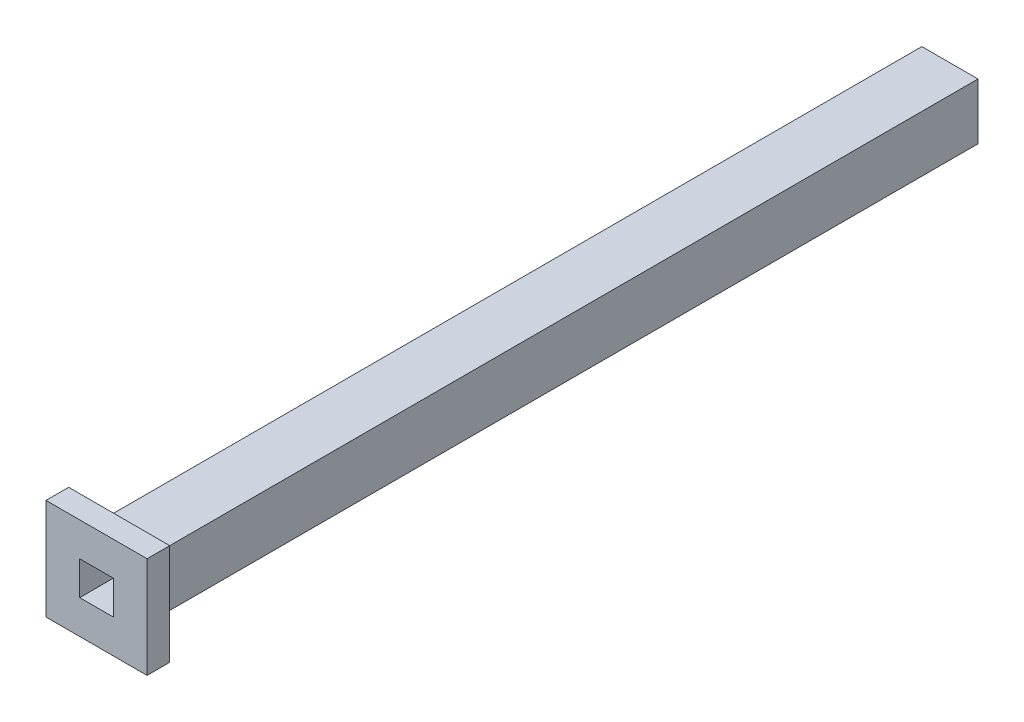
ISO-10303-21;
HEADER;
FILE_DESCRIPTION(('STEP AP214'),'2;1');
FILE_NAME('part.step','',(''),(''),'','','');
FILE_SCHEMA(('AUTOMOTIVE_DESIGN { 1 0 10303 214 1 1 1 1 }'));
ENDSEC;
DATA;
#1=APPLICATION_CONTEXT('core data for automotive mechanical design processes');
#2=APPLICATION_PROTOCOL_DEFINITION('international standard','automotive_design',2000,#1);
#3=PRODUCT_CONTEXT('',#1,'mechanical');
#4=PRODUCT('Part','Part','',(#3));
#5=PRODUCT_RELATED_PRODUCT_CATEGORY('part','',(#4));
#6=PRODUCT_DEFINITION_FORMATION('','',#4);
#7=PRODUCT_DEFINITION_CONTEXT('part definition',#1,'design');
#8=PRODUCT_DEFINITION('design','',#6,#7);
#9=PRODUCT_DEFINITION_SHAPE('','',#8);
#10=(LENGTH_UNIT() NAMED_UNIT(*) SI_UNIT(.MILLI.,.METRE.));
#11=(NAMED_UNIT(*) PLANE_ANGLE_UNIT() SI_UNIT($,.RADIAN.));
#12=(NAMED_UNIT(*) SI_UNIT($,.STERADIAN.) SOLID_ANGLE_UNIT());
#13=UNCERTAINTY_MEASURE_WITH_UNIT(LENGTH_MEASURE(1.E-05),#10,'distance_accuracy_value','');
#14=(GEOMETRIC_REPRESENTATION_CONTEXT(3) GLOBAL_UNCERTAINTY_ASSIGNED_CONTEXT((#13)) GLOBAL_UNIT_ASSIGNED_CONTEXT((#10,
#11,#12)) REPRESENTATION_CONTEXT('',''));
#15=CARTESIAN_POINT('',(0.,0.,0.));
#16=DIRECTION('',(0.,0.,1.));
#17=DIRECTION('',(1.,0.,0.));
#18=AXIS2_PLACEMENT_3D('',#15,#16,#17);
#19=CARTESIAN_POINT('',(0.,0.,0.5));
#20=DIRECTION('',(0.,0.,1.));
#21=DIRECTION('',(1.,0.,0.));
#22=AXIS2_PLACEMENT_3D('',#19,#20,#21);
#23=PLANE('',#22);
#24=DIRECTION('',(0.,-1.,0.));
#25=VECTOR('',#24,1.);
#26=CARTESIAN_POINT('',(11.,0.,0.5));
#27=LINE('',#26,#25);
#28=CARTESIAN_POINT('',(11.,9.,0.5));
#29=VERTEX_POINT('',#28);
#30=CARTESIAN_POINT('',(11.,-5.,0.5));
#31=VERTEX_POINT('',#30);
#32=EDGE_CURVE('E11',#29,#31,#27,.T.);
#33=ORIENTED_EDGE('',*,*,#32,.F.);
#34=DIRECTION('',(1.,0.,0.));
#35=VECTOR('',#34,1.);
#36=CARTESIAN_POINT('',(0.,9.,0.5));
#37=LINE('',#36,#35);
#38=CARTESIAN_POINT('',(-3.,9.,0.5));
#39=VERTEX_POINT('',#38);
#40=EDGE_CURVE('E273',#39,#29,#37,.T.);
#41=ORIENTED_EDGE('',*,*,#40,.F.);
#42=DIRECTION('',(0.,1.,0.));
#43=VECTOR('',#42,1.);
#44=CARTESIAN_POINT('',(-3.,0.,0.5));
#45=LINE('',#44,#43);
#46=CARTESIAN_POINT('',(-3.,-5.,0.5));
#47=VERTEX_POINT('',#46);
#48=EDGE_CURVE('E275',#47,#39,#45,.T.);
#49=ORIENTED_EDGE('',*,*,#48,.F.);
#50=DIRECTION('',(-1.,0.,0.));
#51=VECTOR('',#50,1.);
#52=CARTESIAN_POINT('',(0.,-5.,0.5));
#53=LINE('',#52,#51);
#54=EDGE_CURVE('E45',#31,#47,#53,.T.);
#55=ORIENTED_EDGE('',*,*,#54,.F.);
#56=EDGE_LOOP('',(#33,#41,#49,#55));
#57=FACE_BOUND('',#56,.T.);
#58=DIRECTION('',(0.,-1.,0.));
#59=VECTOR('',#58,1.);
#60=CARTESIAN_POINT('',(13.,11.,0.5));
#61=LINE('',#60,#59);
#62=CARTESIAN_POINT('',(13.,11.,0.5));
#63=VERTEX_POINT('',#62);
#64=CARTESIAN_POINT('',(13.,-7.,0.5));
#65=VERTEX_POINT('',#64);
#66=EDGE_CURVE('E226',#63,#65,#61,.T.);
#67=ORIENTED_EDGE('',*,*,#66,.T.);
#68=DIRECTION('',(-1.,0.,0.));
#69=VECTOR('',#68,1.);
#70=CARTESIAN_POINT('',(13.,-7.,0.5));
#71=LINE('',#70,#69);
#72=CARTESIAN_POINT('',(-5.,-7.,0.5));
#73=VERTEX_POINT('',#72);
#74=EDGE_CURVE('E229',#65,#73,#71,.T.);
#75=ORIENTED_EDGE('',*,*,#74,.T.);
#76=DIRECTION('',(0.,1.,0.));
#77=VECTOR('',#76,1.);
#78=CARTESIAN_POINT('',(-5.,11.,0.5));
#79=LINE('',#78,#77);
#80=CARTESIAN_POINT('',(-5.,11.,0.5));
#81=VERTEX_POINT('',#80);
#82=EDGE_CURVE('E232',#73,#81,#79,.T.);
#83=ORIENTED_EDGE('',*,*,#82,.T.);
#84=DIRECTION('',(1.,0.,0.));
#85=VECTOR('',#84,1.);
#86=CARTESIAN_POINT('',(13.,11.,0.5));
#87=LINE('',#86,#85);
#88=EDGE_CURVE('E235',#81,#63,#87,.T.);
#89=ORIENTED_EDGE('',*,*,#88,.T.);
#90=EDGE_LOOP('',(#67,#75,#83,#89));
#91=FACE_BOUND('',#90,.T.);
#92=ADVANCED_FACE('F38',(#57,#91),#23,.F.);
#93=CARTESIAN_POINT('',(0.,0.,4.54));
#94=DIRECTION('',(0.,0.,1.));
#95=DIRECTION('',(1.,0.,0.));
#96=AXIS2_PLACEMENT_3D('',#93,#94,#95);
#97=PLANE('',#96);
#98=DIRECTION('',(0.,-1.,0.));
#99=VECTOR('',#98,1.);
#100=CARTESIAN_POINT('',(-5.,11.,4.54));
#101=LINE('',#100,#99);
#102=CARTESIAN_POINT('',(-5.,11.,4.54));
#103=VERTEX_POINT('',#102);
#104=CARTESIAN_POINT('',(-5.,-7.,4.54));
#105=VERTEX_POINT('',#104);
#106=EDGE_CURVE('E212',#103,#105,#101,.T.);
#107=ORIENTED_EDGE('',*,*,#106,.T.);
#108=DIRECTION('',(1.,0.,0.));
#109=VECTOR('',#108,1.);
#110=CARTESIAN_POINT('',(-5.,-7.,4.54));
#111=LINE('',#110,#109);
#112=CARTESIAN_POINT('',(13.,-7.,4.54));
#113=VERTEX_POINT('',#112);
#114=EDGE_CURVE('E217',#105,#113,#111,.T.);
#115=ORIENTED_EDGE('',*,*,#114,.T.);
#116=DIRECTION('',(0.,1.,0.));
#117=VECTOR('',#116,1.);
#118=CARTESIAN_POINT('',(13.,11.,4.54));
#119=LINE('',#118,#117);
#120=CARTESIAN_POINT('',(13.,11.,4.54));
#121=VERTEX_POINT('',#120);
#122=EDGE_CURVE('E220',#113,#121,#119,.T.);
#123=ORIENTED_EDGE('',*,*,#122,.T.);
#124=DIRECTION('',(-1.,0.,0.));
#125=VECTOR('',#124,1.);
#126=CARTESIAN_POINT('',(-5.,11.,4.54));
#127=LINE('',#126,#125);
#128=EDGE_CURVE('E223',#121,#103,#127,.T.);
#129=ORIENTED_EDGE('',*,*,#128,.T.);
#130=EDGE_LOOP('',(#107,#115,#123,#129));
#131=FACE_BOUND('',#130,.T.);
#132=DIRECTION('',(0.,-1.,0.));
#133=VECTOR('',#132,1.);
#134=CARTESIAN_POINT('',(1.,5.,4.54));
#135=LINE('',#134,#133);
#136=CARTESIAN_POINT('',(1.,5.,4.54));
#137=VERTEX_POINT('',#136);
#138=CARTESIAN_POINT('',(1.,-1.,4.54));
#139=VERTEX_POINT('',#138);
#140=EDGE_CURVE('E177',#137,#139,#135,.T.);
#141=ORIENTED_EDGE('',*,*,#140,.F.);
#142=DIRECTION('',(-1.,0.,0.));
#143=VECTOR('',#142,1.);
#144=CARTESIAN_POINT('',(1.,5.,4.54));
#145=LINE('',#144,#143);
#146=CARTESIAN_POINT('',(7.,5.,4.54));
#147=VERTEX_POINT('',#146);
#148=EDGE_CURVE('E182',#147,#137,#145,.T.);
#149=ORIENTED_EDGE('',*,*,#148,.F.);
#150=DIRECTION('',(0.,1.,0.));
#151=VECTOR('',#150,1.);
#152=CARTESIAN_POINT('',(7.,5.,4.54));
#153=LINE('',#152,#151);
#154=CARTESIAN_POINT('',(7.,-1.,4.54));
#155=VERTEX_POINT('',#154);
#156=EDGE_CURVE('E196',#155,#147,#153,.T.);
#157=ORIENTED_EDGE('',*,*,#156,.F.);
#158=DIRECTION('',(1.,0.,0.));
#159=VECTOR('',#158,1.);
#160=CARTESIAN_POINT('',(1.,-1.,4.54));
#161=LINE('',#160,#159);
#162=EDGE_CURVE('E193',#139,#155,#161,.T.);
#163=ORIENTED_EDGE('',*,*,#162,.F.);
#164=EDGE_LOOP('',(#141,#149,#157,#163));
#165=FACE_BOUND('',#164,.T.);
#166=ADVANCED_FACE('F298',(#131,#165),#97,.T.);
#167=CARTESIAN_POINT('',(0.,0.,2.54));
#168=DIRECTION('',(0.,0.,1.));
#169=DIRECTION('',(1.,0.,0.));
#170=AXIS2_PLACEMENT_3D('',#167,#168,#169);
#171=PLANE('',#170);
#172=DIRECTION('',(-1.,0.,0.));
#173=VECTOR('',#172,1.);
#174=CARTESIAN_POINT('',(9.,-3.,2.54));
#175=LINE('',#174,#173);
#176=CARTESIAN_POINT('',(9.,-3.,2.54));
#177=VERTEX_POINT('',#176);
#178=CARTESIAN_POINT('',(-0.999999999999999,-3.,2.53999999999999));
#179=VERTEX_POINT('',#178);
#180=EDGE_CURVE('E60',#177,#179,#175,.T.);
#181=ORIENTED_EDGE('',*,*,#180,.F.);
#182=DIRECTION('',(0.,-1.,0.));
#183=VECTOR('',#182,1.);
#184=CARTESIAN_POINT('',(9.,7.,2.54));
#185=LINE('',#184,#183);
#186=CARTESIAN_POINT('',(9.,7.,2.54));
#187=VERTEX_POINT('',#186);
#188=EDGE_CURVE('E155',#187,#177,#185,.T.);
#189=ORIENTED_EDGE('',*,*,#188,.F.);
#190=DIRECTION('',(1.,0.,0.));
#191=VECTOR('',#190,1.);
#192=CARTESIAN_POINT('',(9.,7.,2.54));
#193=LINE('',#192,#191);
#194=CARTESIAN_POINT('',(-0.999999999999999,7.,2.54));
#195=VERTEX_POINT('',#194);
#196=EDGE_CURVE('E270',#195,#187,#193,.T.);
#197=ORIENTED_EDGE('',*,*,#196,.F.);
#198=DIRECTION('',(0.,1.,0.));
#199=VECTOR('',#198,1.);
#200=CARTESIAN_POINT('',(-0.999999999999999,7.,2.54));
#201=LINE('',#200,#199);
#202=EDGE_CURVE('E267',#179,#195,#201,.T.);
#203=ORIENTED_EDGE('',*,*,#202,.F.);
#204=EDGE_LOOP('',(#181,#189,#197,#203));
#205=FACE_BOUND('',#204,.T.);
#206=DIRECTION('',(0.,-1.,0.));
#207=VECTOR('',#206,1.);
#208=CARTESIAN_POINT('',(11.,9.,2.54));
#209=LINE('',#208,#207);
#210=CARTESIAN_POINT('',(11.,9.,2.54));
#211=VERTEX_POINT('',#210);
#212=CARTESIAN_POINT('',(11.,-5.,2.54));
#213=VERTEX_POINT('',#212);
#214=EDGE_CURVE('E241',#211,#213,#209,.T.);
#215=ORIENTED_EDGE('',*,*,#214,.T.);
#216=DIRECTION('',(-1.,0.,0.));
#217=VECTOR('',#216,1.);
#218=CARTESIAN_POINT('',(11.,-5.,2.54));
#219=LINE('',#218,#217);
#220=CARTESIAN_POINT('',(-3.,-5.,2.54));
#221=VERTEX_POINT('',#220);
#222=EDGE_CURVE('E249',#213,#221,#219,.T.);
#223=ORIENTED_EDGE('',*,*,#222,.T.);
#224=DIRECTION('',(0.,1.,0.));
#225=VECTOR('',#224,1.);
#226=CARTESIAN_POINT('',(-3.,9.,2.54));
#227=LINE('',#226,#225);
#228=CARTESIAN_POINT('',(-3.,9.,2.54));
#229=VERTEX_POINT('',#228);
#230=EDGE_CURVE('E252',#221,#229,#227,.T.);
#231=ORIENTED_EDGE('',*,*,#230,.T.);
#232=DIRECTION('',(1.,0.,0.));
#233=VECTOR('',#232,1.);
#234=CARTESIAN_POINT('',(11.,9.,2.54));
#235=LINE('',#234,#233);
#236=EDGE_CURVE('E255',#229,#211,#235,.T.);
#237=ORIENTED_EDGE('',*,*,#236,.T.);
#238=EDGE_LOOP('',(#215,#223,#231,#237));
#239=FACE_BOUND('',#238,.T.);
#240=ADVANCED_FACE('F296',(#205,#239),#171,.F.);
#241=CARTESIAN_POINT('',(11.,9.,-7.46));
#242=DIRECTION('',(-1.,0.,0.));
#243=DIRECTION('',(0.,-1.,0.));
#244=AXIS2_PLACEMENT_3D('',#241,#242,#243);
#245=PLANE('',#244);
#246=ORIENTED_EDGE('',*,*,#32,.T.);
#247=DIRECTION('',(0.,0.,1.));
#248=VECTOR('',#247,1.);
#249=CARTESIAN_POINT('',(11.,-5.,-7.46));
#250=LINE('',#249,#248);
#251=EDGE_CURVE('E263',#31,#213,#250,.T.);
#252=ORIENTED_EDGE('',*,*,#251,.T.);
#253=ORIENTED_EDGE('',*,*,#214,.F.);
#254=DIRECTION('',(0.,0.,1.));
#255=VECTOR('',#254,1.);
#256=CARTESIAN_POINT('',(11.,9.,-7.46));
#257=LINE('',#256,#255);
#258=EDGE_CURVE('E258',#29,#211,#257,.T.);
#259=ORIENTED_EDGE('',*,*,#258,.F.);
#260=EDGE_LOOP('',(#246,#252,#253,#259));
#261=FACE_BOUND('',#260,.T.);
#262=ADVANCED_FACE('F294',(#261),#245,.T.);
#263=CARTESIAN_POINT('',(11.,-5.,-7.46));
#264=DIRECTION('',(0.,1.,0.));
#265=DIRECTION('',(0.,0.,1.));
#266=AXIS2_PLACEMENT_3D('',#263,#264,#265);
#267=PLANE('',#266);
#268=ORIENTED_EDGE('',*,*,#54,.T.);
#269=DIRECTION('',(0.,0.,1.));
#270=VECTOR('',#269,1.);
#271=CARTESIAN_POINT('',(-3.,-5.,-7.46));
#272=LINE('',#271,#270);
#273=EDGE_CURVE('E261',#47,#221,#272,.T.);
#274=ORIENTED_EDGE('',*,*,#273,.T.);
#275=ORIENTED_EDGE('',*,*,#222,.F.);
#276=ORIENTED_EDGE('',*,*,#251,.F.);
#277=EDGE_LOOP('',(#268,#274,#275,#276));
#278=FACE_BOUND('',#277,.T.);
#279=ADVANCED_FACE('F280',(#278),#267,.T.);
#280=CARTESIAN_POINT('',(-3.,9.,-7.46));
#281=DIRECTION('',(1.,0.,0.));
#282=DIRECTION('',(0.,1.,0.));
#283=AXIS2_PLACEMENT_3D('',#280,#281,#282);
#284=PLANE('',#283);
#285=ORIENTED_EDGE('',*,*,#48,.T.);
#286=DIRECTION('',(0.,0.,1.));
#287=VECTOR('',#286,1.);
#288=CARTESIAN_POINT('',(-3.,9.,-7.46));
#289=LINE('',#288,#287);
#290=EDGE_CURVE('E52',#39,#229,#289,.T.);
#291=ORIENTED_EDGE('',*,*,#290,.T.);
#292=ORIENTED_EDGE('',*,*,#230,.F.);
#293=ORIENTED_EDGE('',*,*,#273,.F.);
#294=EDGE_LOOP('',(#285,#291,#292,#293));
#295=FACE_BOUND('',#294,.T.);
#296=ADVANCED_FACE('F287',(#295),#284,.T.);
#297=CARTESIAN_POINT('',(11.,9.,-7.46));
#298=DIRECTION('',(0.,-1.,0.));
#299=DIRECTION('',(0.,0.,-1.));
#300=AXIS2_PLACEMENT_3D('',#297,#298,#299);
#301=PLANE('',#300);
#302=ORIENTED_EDGE('',*,*,#40,.T.);
#303=ORIENTED_EDGE('',*,*,#258,.T.);
#304=ORIENTED_EDGE('',*,*,#236,.F.);
#305=ORIENTED_EDGE('',*,*,#290,.F.);
#306=EDGE_LOOP('',(#302,#303,#304,#305));
#307=FACE_BOUND('',#306,.T.);
#308=ADVANCED_FACE('F291',(#307),#301,.T.);
#309=CARTESIAN_POINT('',(13.,11.,4.5));
#310=DIRECTION('',(1.,0.,0.));
#311=DIRECTION('',(0.,1.,0.));
#312=AXIS2_PLACEMENT_3D('',#309,#310,#311);
#313=PLANE('',#312);
#314=DIRECTION('',(0.,0.,-1.));
#315=VECTOR('',#314,1.);
#316=CARTESIAN_POINT('',(13.,-7.,4.5));
#317=LINE('',#316,#315);
#318=EDGE_CURVE('E238',#113,#65,#317,.T.);
#319=ORIENTED_EDGE('',*,*,#318,.T.);
#320=ORIENTED_EDGE('',*,*,#66,.F.);
#321=DIRECTION('',(0.,0.,-1.));
#322=VECTOR('',#321,1.);
#323=CARTESIAN_POINT('',(13.,11.,4.5));
#324=LINE('',#323,#322);
#325=EDGE_CURVE('E239',#121,#63,#324,.T.);
#326=ORIENTED_EDGE('',*,*,#325,.F.);
#327=ORIENTED_EDGE('',*,*,#122,.F.);
#328=EDGE_LOOP('',(#319,#320,#326,#327));
#329=FACE_BOUND('',#328,.T.);
#330=ADVANCED_FACE('F436',(#329),#313,.T.);
#331=CARTESIAN_POINT('',(13.,11.,4.5));
#332=DIRECTION('',(0.,1.,0.));
#333=DIRECTION('',(0.,0.,1.));
#334=AXIS2_PLACEMENT_3D('',#331,#332,#333);
#335=PLANE('',#334);
#336=ORIENTED_EDGE('',*,*,#325,.T.);
#337=ORIENTED_EDGE('',*,*,#88,.F.);
#338=DIRECTION('',(0.,0.,-1.));
#339=VECTOR('',#338,1.);
#340=CARTESIAN_POINT('',(-5.,11.,4.5));
#341=LINE('',#340,#339);
#342=EDGE_CURVE('E242',#103,#81,#341,.T.);
#343=ORIENTED_EDGE('',*,*,#342,.F.);
#344=ORIENTED_EDGE('',*,*,#128,.F.);
#345=EDGE_LOOP('',(#336,#337,#343,#344));
#346=FACE_BOUND('',#345,.T.);
#347=ADVANCED_FACE('F432',(#346),#335,.T.);
#348=CARTESIAN_POINT('',(-5.,11.,4.5));
#349=DIRECTION('',(-1.,0.,0.));
#350=DIRECTION('',(0.,-1.,0.));
#351=AXIS2_PLACEMENT_3D('',#348,#349,#350);
#352=PLANE('',#351);
#353=ORIENTED_EDGE('',*,*,#342,.T.);
#354=ORIENTED_EDGE('',*,*,#82,.F.);
#355=DIRECTION('',(0.,0.,-1.));
#356=VECTOR('',#355,1.);
#357=CARTESIAN_POINT('',(-5.,-7.,4.5));
#358=LINE('',#357,#356);
#359=EDGE_CURVE('E244',#105,#73,#358,.T.);
#360=ORIENTED_EDGE('',*,*,#359,.F.);
#361=ORIENTED_EDGE('',*,*,#106,.F.);
#362=EDGE_LOOP('',(#353,#354,#360,#361));
#363=FACE_BOUND('',#362,.T.);
#364=ADVANCED_FACE('F435',(#363),#352,.T.);
#365=CARTESIAN_POINT('',(13.,-7.,4.5));
#366=DIRECTION('',(0.,-1.,0.));
#367=DIRECTION('',(0.,0.,-1.));
#368=AXIS2_PLACEMENT_3D('',#365,#366,#367);
#369=PLANE('',#368);
#370=ORIENTED_EDGE('',*,*,#359,.T.);
#371=ORIENTED_EDGE('',*,*,#74,.F.);
#372=ORIENTED_EDGE('',*,*,#318,.F.);
#373=ORIENTED_EDGE('',*,*,#114,.F.);
#374=EDGE_LOOP('',(#370,#371,#372,#373));
#375=FACE_BOUND('',#374,.T.);
#376=ADVANCED_FACE('F323',(#375),#369,.T.);
#377=CARTESIAN_POINT('',(-0.999999999999999,7.,-145.46));
#378=DIRECTION('',(0.,1.,0.));
#379=DIRECTION('',(0.,0.,1.));
#380=AXIS2_PLACEMENT_3D('',#377,#378,#379);
#381=PLANE('',#380);
#382=ORIENTED_EDGE('',*,*,#196,.T.);
#383=DIRECTION('',(0.,0.,1.));
#384=VECTOR('',#383,1.);
#385=CARTESIAN_POINT('',(9.,7.,-145.46));
#386=LINE('',#385,#384);
#387=CARTESIAN_POINT('',(9.,7.,-147.46));
#388=VERTEX_POINT('',#387);
#389=EDGE_CURVE('E157',#388,#187,#386,.T.);
#390=ORIENTED_EDGE('',*,*,#389,.F.);
#391=DIRECTION('',(1.,0.,0.));
#392=VECTOR('',#391,1.);
#393=CARTESIAN_POINT('',(9.,7.,-147.46));
#394=LINE('',#393,#392);
#395=CARTESIAN_POINT('',(-0.999999999999999,7.,-147.46));
#396=VERTEX_POINT('',#395);
#397=EDGE_CURVE('E172',#396,#388,#394,.T.);
#398=ORIENTED_EDGE('',*,*,#397,.F.);
#399=DIRECTION('',(0.,0.,1.));
#400=VECTOR('',#399,1.);
#401=CARTESIAN_POINT('',(-0.999999999999999,7.,-145.46));
#402=LINE('',#401,#400);
#403=EDGE_CURVE('E209',#396,#195,#402,.T.);
#404=ORIENTED_EDGE('',*,*,#403,.T.);
#405=EDGE_LOOP('',(#382,#390,#398,#404));
#406=FACE_BOUND('',#405,.T.);
#407=ADVANCED_FACE('F335',(#406),#381,.T.);
#408=CARTESIAN_POINT('',(-0.999999999999999,-3.,-145.46));
#409=DIRECTION('',(0.,-1.,0.));
#410=DIRECTION('',(0.,0.,-1.));
#411=AXIS2_PLACEMENT_3D('',#408,#409,#410);
#412=PLANE('',#411);
#413=ORIENTED_EDGE('',*,*,#180,.T.);
#414=DIRECTION('',(0.,0.,1.));
#415=VECTOR('',#414,1.);
#416=CARTESIAN_POINT('',(-0.999999999999999,-3.,-145.46));
#417=LINE('',#416,#415);
#418=CARTESIAN_POINT('',(-0.999999999999999,-3.,-147.46));
#419=VERTEX_POINT('',#418);
#420=EDGE_CURVE('E158',#419,#179,#417,.T.);
#421=ORIENTED_EDGE('',*,*,#420,.F.);
#422=DIRECTION('',(-1.,0.,0.));
#423=VECTOR('',#422,1.);
#424=CARTESIAN_POINT('',(9.,-3.,-147.46));
#425=LINE('',#424,#423);
#426=CARTESIAN_POINT('',(9.,-3.,-147.46));
#427=VERTEX_POINT('',#426);
#428=EDGE_CURVE('E161',#427,#419,#425,.T.);
#429=ORIENTED_EDGE('',*,*,#428,.F.);
#430=DIRECTION('',(0.,0.,1.));
#431=VECTOR('',#430,1.);
#432=CARTESIAN_POINT('',(9.,-3.,-145.46));
#433=LINE('',#432,#431);
#434=EDGE_CURVE('E149',#427,#177,#433,.T.);
#435=ORIENTED_EDGE('',*,*,#434,.T.);
#436=EDGE_LOOP('',(#413,#421,#429,#435));
#437=FACE_BOUND('',#436,.T.);
#438=ADVANCED_FACE('F162',(#437),#412,.T.);
#439=CARTESIAN_POINT('',(-0.999999999999999,7.,-145.46));
#440=DIRECTION('',(-1.,0.,0.));
#441=DIRECTION('',(0.,0.,1.));
#442=AXIS2_PLACEMENT_3D('',#439,#440,#441);
#443=PLANE('',#442);
#444=ORIENTED_EDGE('',*,*,#202,.T.);
#445=ORIENTED_EDGE('',*,*,#403,.F.);
#446=DIRECTION('',(0.,1.,0.));
#447=VECTOR('',#446,1.);
#448=CARTESIAN_POINT('',(-0.999999999999999,7.,-147.46));
#449=LINE('',#448,#447);
#450=EDGE_CURVE('E167',#419,#396,#449,.T.);
#451=ORIENTED_EDGE('',*,*,#450,.F.);
#452=ORIENTED_EDGE('',*,*,#420,.T.);
#453=EDGE_LOOP('',(#444,#445,#451,#452));
#454=FACE_BOUND('',#453,.T.);
#455=ADVANCED_FACE('F350',(#454),#443,.T.);
#456=CARTESIAN_POINT('',(9.,7.,-145.46));
#457=DIRECTION('',(1.,0.,0.));
#458=DIRECTION('',(0.,0.,-1.));
#459=AXIS2_PLACEMENT_3D('',#456,#457,#458);
#460=PLANE('',#459);
#461=ORIENTED_EDGE('',*,*,#188,.T.);
#462=ORIENTED_EDGE('',*,*,#434,.F.);
#463=DIRECTION('',(0.,-1.,0.));
#464=VECTOR('',#463,1.);
#465=CARTESIAN_POINT('',(9.,7.,-147.46));
#466=LINE('',#465,#464);
#467=EDGE_CURVE('E154',#388,#427,#466,.T.);
#468=ORIENTED_EDGE('',*,*,#467,.F.);
#469=ORIENTED_EDGE('',*,*,#389,.T.);
#470=EDGE_LOOP('',(#461,#462,#468,#469));
#471=FACE_BOUND('',#470,.T.);
#472=ADVANCED_FACE('F151',(#471),#460,.T.);
#473=CARTESIAN_POINT('',(1.,5.,-145.46));
#474=DIRECTION('',(-1.,0.,0.));
#475=DIRECTION('',(0.,-1.,0.));
#476=AXIS2_PLACEMENT_3D('',#473,#474,#475);
#477=PLANE('',#476);
#478=ORIENTED_EDGE('',*,*,#140,.T.);
#479=DIRECTION('',(0.,0.,1.));
#480=VECTOR('',#479,1.);
#481=CARTESIAN_POINT('',(1.,-1.,-145.46));
#482=LINE('',#481,#480);
#483=CARTESIAN_POINT('',(1.,-1.,-145.46));
#484=VERTEX_POINT('',#483);
#485=EDGE_CURVE('E191',#484,#139,#482,.T.);
#486=ORIENTED_EDGE('',*,*,#485,.F.);
#487=DIRECTION('',(0.,-1.,0.));
#488=VECTOR('',#487,1.);
#489=CARTESIAN_POINT('',(1.,5.,-145.46));
#490=LINE('',#489,#488);
#491=CARTESIAN_POINT('',(1.,5.,-145.46));
#492=VERTEX_POINT('',#491);
#493=EDGE_CURVE('E178',#492,#484,#490,.T.);
#494=ORIENTED_EDGE('',*,*,#493,.F.);
#495=DIRECTION('',(0.,0.,1.));
#496=VECTOR('',#495,1.);
#497=CARTESIAN_POINT('',(1.,5.,-145.46));
#498=LINE('',#497,#496);
#499=EDGE_CURVE('E201',#492,#137,#498,.T.);
#500=ORIENTED_EDGE('',*,*,#499,.T.);
#501=EDGE_LOOP('',(#478,#486,#494,#500));
#502=FACE_BOUND('',#501,.T.);
#503=ADVANCED_FACE('F370',(#502),#477,.F.);
#504=CARTESIAN_POINT('',(1.,5.,-145.46));
#505=DIRECTION('',(0.,1.,0.));
#506=DIRECTION('',(0.,0.,1.));
#507=AXIS2_PLACEMENT_3D('',#504,#505,#506);
#508=PLANE('',#507);
#509=ORIENTED_EDGE('',*,*,#148,.T.);
#510=ORIENTED_EDGE('',*,*,#499,.F.);
#511=DIRECTION('',(-1.,0.,0.));
#512=VECTOR('',#511,1.);
#513=CARTESIAN_POINT('',(1.,5.,-145.46));
#514=LINE('',#513,#512);
#515=CARTESIAN_POINT('',(7.,5.,-145.46));
#516=VERTEX_POINT('',#515);
#517=EDGE_CURVE('E188',#516,#492,#514,.T.);
#518=ORIENTED_EDGE('',*,*,#517,.F.);
#519=DIRECTION('',(0.,0.,1.));
#520=VECTOR('',#519,1.);
#521=CARTESIAN_POINT('',(7.,5.,-145.46));
#522=LINE('',#521,#520);
#523=EDGE_CURVE('E203',#516,#147,#522,.T.);
#524=ORIENTED_EDGE('',*,*,#523,.T.);
#525=EDGE_LOOP('',(#509,#510,#518,#524));
#526=FACE_BOUND('',#525,.T.);
#527=ADVANCED_FACE('F381',(#526),#508,.F.);
#528=CARTESIAN_POINT('',(7.,5.,-145.46));
#529=DIRECTION('',(1.,0.,0.));
#530=DIRECTION('',(0.,1.,0.));
#531=AXIS2_PLACEMENT_3D('',#528,#529,#530);
#532=PLANE('',#531);
#533=ORIENTED_EDGE('',*,*,#156,.T.);
#534=ORIENTED_EDGE('',*,*,#523,.F.);
#535=DIRECTION('',(0.,1.,0.));
#536=VECTOR('',#535,1.);
#537=CARTESIAN_POINT('',(7.,5.,-145.46));
#538=LINE('',#537,#536);
#539=CARTESIAN_POINT('',(7.,-1.,-145.46));
#540=VERTEX_POINT('',#539);
#541=EDGE_CURVE('E185',#540,#516,#538,.T.);
#542=ORIENTED_EDGE('',*,*,#541,.F.);
#543=DIRECTION('',(0.,0.,1.));
#544=VECTOR('',#543,1.);
#545=CARTESIAN_POINT('',(7.,-1.,-145.46));
#546=LINE('',#545,#544);
#547=EDGE_CURVE('E205',#540,#155,#546,.T.);
#548=ORIENTED_EDGE('',*,*,#547,.T.);
#549=EDGE_LOOP('',(#533,#534,#542,#548));
#550=FACE_BOUND('',#549,.T.);
#551=ADVANCED_FACE('F391',(#550),#532,.F.);
#552=CARTESIAN_POINT('',(1.,-1.,-145.46));
#553=DIRECTION('',(0.,-1.,0.));
#554=DIRECTION('',(0.,0.,-1.));
#555=AXIS2_PLACEMENT_3D('',#552,#553,#554);
#556=PLANE('',#555);
#557=ORIENTED_EDGE('',*,*,#162,.T.);
#558=ORIENTED_EDGE('',*,*,#547,.F.);
#559=DIRECTION('',(1.,0.,0.));
#560=VECTOR('',#559,1.);
#561=CARTESIAN_POINT('',(1.,-1.,-145.46));
#562=LINE('',#561,#560);
#563=EDGE_CURVE('E181',#484,#540,#562,.T.);
#564=ORIENTED_EDGE('',*,*,#563,.F.);
#565=ORIENTED_EDGE('',*,*,#485,.T.);
#566=EDGE_LOOP('',(#557,#558,#564,#565));
#567=FACE_BOUND('',#566,.T.);
#568=ADVANCED_FACE('F401',(#567),#556,.F.);
#569=CARTESIAN_POINT('',(0.,0.,-145.46));
#570=DIRECTION('',(0.,0.,-1.));
#571=DIRECTION('',(-1.,0.,0.));
#572=AXIS2_PLACEMENT_3D('',#569,#570,#571);
#573=PLANE('',#572);
#574=ORIENTED_EDGE('',*,*,#541,.T.);
#575=ORIENTED_EDGE('',*,*,#517,.T.);
#576=ORIENTED_EDGE('',*,*,#493,.T.);
#577=ORIENTED_EDGE('',*,*,#563,.T.);
#578=EDGE_LOOP('',(#574,#575,#576,#577));
#579=FACE_BOUND('',#578,.T.);
#580=ADVANCED_FACE('F410',(#579),#573,.F.);
#581=CARTESIAN_POINT('',(0.,0.,-147.46));
#582=DIRECTION('',(0.,0.,-1.));
#583=DIRECTION('',(-1.,0.,0.));
#584=AXIS2_PLACEMENT_3D('',#581,#582,#583);
#585=PLANE('',#584);
#586=ORIENTED_EDGE('',*,*,#467,.T.);
#587=ORIENTED_EDGE('',*,*,#428,.T.);
#588=ORIENTED_EDGE('',*,*,#450,.T.);
#589=ORIENTED_EDGE('',*,*,#397,.T.);
#590=EDGE_LOOP('',(#586,#587,#588,#589));
#591=FACE_BOUND('',#590,.T.);
#592=ADVANCED_FACE('F170',(#591),#585,.T.);
#593=CLOSED_SHELL('',(#92,#166,#240,#262,#279,#296,#308,#330,#347,#364,#376,#407,#438,#455,#472,
#503,#527,#551,#568,#580,#592));
#594=MANIFOLD_SOLID_BREP('B2',#593);
#595=ADVANCED_BREP_SHAPE_REPRESENTATION('',(#18,#594),#14);
#596=SHAPE_DEFINITION_REPRESENTATION(#9,#595);
ENDSEC;
END-ISO-10303-21;
